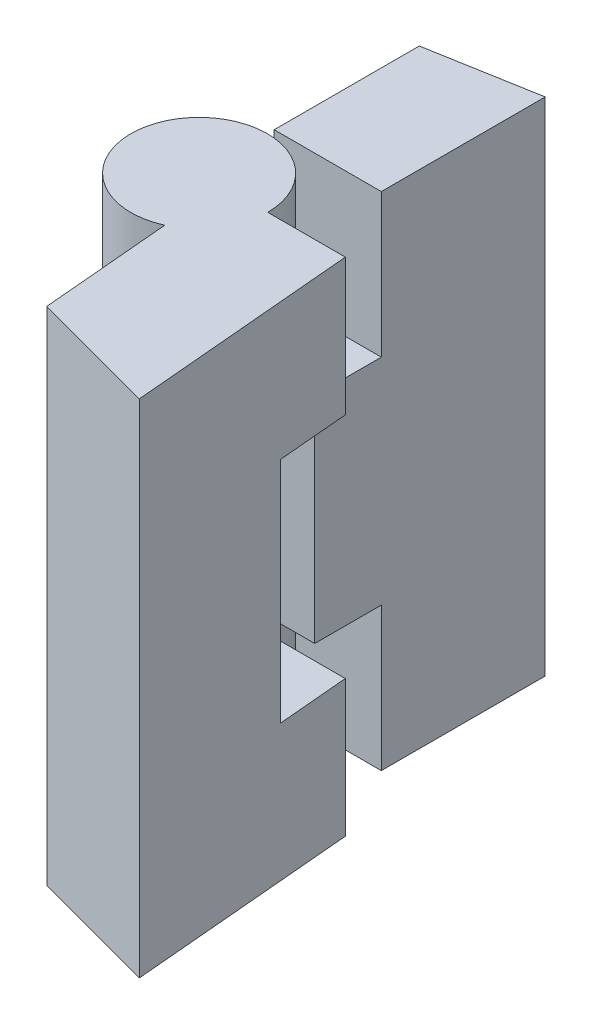
ISO-10303-21;
HEADER;
FILE_DESCRIPTION(('STEP AP214'),'2;1');
FILE_NAME('part.step','',(''),(''),'','','');
FILE_SCHEMA(('AUTOMOTIVE_DESIGN { 1 0 10303 214 1 1 1 1 }'));
ENDSEC;
DATA;
#1=APPLICATION_CONTEXT('core data for automotive mechanical design processes');
#2=APPLICATION_PROTOCOL_DEFINITION('international standard','automotive_design',2000,#1);
#3=PRODUCT_CONTEXT('',#1,'mechanical');
#4=PRODUCT('Part','Part','',(#3));
#5=PRODUCT_RELATED_PRODUCT_CATEGORY('part','',(#4));
#6=PRODUCT_DEFINITION_FORMATION('','',#4);
#7=PRODUCT_DEFINITION_CONTEXT('part definition',#1,'design');
#8=PRODUCT_DEFINITION('design','',#6,#7);
#9=PRODUCT_DEFINITION_SHAPE('','',#8);
#10=(LENGTH_UNIT() NAMED_UNIT(*) SI_UNIT(.MILLI.,.METRE.));
#11=(NAMED_UNIT(*) PLANE_ANGLE_UNIT() SI_UNIT($,.RADIAN.));
#12=(NAMED_UNIT(*) SI_UNIT($,.STERADIAN.) SOLID_ANGLE_UNIT());
#13=UNCERTAINTY_MEASURE_WITH_UNIT(LENGTH_MEASURE(1.E-05),#10,'distance_accuracy_value','');
#14=(GEOMETRIC_REPRESENTATION_CONTEXT(3) GLOBAL_UNCERTAINTY_ASSIGNED_CONTEXT((#13)) GLOBAL_UNIT_ASSIGNED_CONTEXT((#10,
#11,#12)) REPRESENTATION_CONTEXT('',''));
#15=CARTESIAN_POINT('',(0.,0.,0.));
#16=DIRECTION('',(0.,0.,1.));
#17=DIRECTION('',(1.,0.,0.));
#18=AXIS2_PLACEMENT_3D('',#15,#16,#17);
#19=CARTESIAN_POINT('',(-149.098,172.2882,110.56875));
#20=DIRECTION('',(0.173648177666924,0.,0.984807753012209));
#21=DIRECTION('',(0.984807753012209,0.,-0.173648177666924));
#22=AXIS2_PLACEMENT_3D('',#19,#20,#21);
#23=PLANE('',#22);
#24=DIRECTION('',(0.,1.,0.));
#25=VECTOR('',#24,1.);
#26=CARTESIAN_POINT('',(-159.0548,172.2882,112.324402481518));
#27=LINE('',#26,#25);
#28=CARTESIAN_POINT('',(-159.0548,125.6538,112.324402481518));
#29=VERTEX_POINT('',#28);
#30=CARTESIAN_POINT('',(-159.0548,172.2882,112.324402481518));
#31=VERTEX_POINT('',#30);
#32=EDGE_CURVE('E219',#29,#31,#27,.T.);
#33=ORIENTED_EDGE('',*,*,#32,.T.);
#34=DIRECTION('',(-0.984807753012209,0.,0.173648177666928));
#35=VECTOR('',#34,1.);
#36=CARTESIAN_POINT('',(-149.098,172.2882,110.56875));
#37=LINE('',#36,#35);
#38=CARTESIAN_POINT('',(-149.098,172.2882,110.56875));
#39=VERTEX_POINT('',#38);
#40=EDGE_CURVE('E163',#39,#31,#37,.T.);
#41=ORIENTED_EDGE('',*,*,#40,.F.);
#42=DIRECTION('',(0.,1.,0.));
#43=VECTOR('',#42,1.);
#44=CARTESIAN_POINT('',(-149.098,172.2882,110.56875));
#45=LINE('',#44,#43);
#46=CARTESIAN_POINT('',(-149.098,125.6538,110.56875));
#47=VERTEX_POINT('',#46);
#48=EDGE_CURVE('E198',#39,#47,#45,.F.);
#49=ORIENTED_EDGE('',*,*,#48,.T.);
#50=DIRECTION('',(-0.984807753012209,0.,0.173648177666928));
#51=VECTOR('',#50,1.);
#52=CARTESIAN_POINT('',(-149.098,125.6538,110.56875));
#53=LINE('',#52,#51);
#54=EDGE_CURVE('E230',#47,#29,#53,.T.);
#55=ORIENTED_EDGE('',*,*,#54,.T.);
#56=EDGE_LOOP('',(#33,#41,#49,#55));
#57=FACE_BOUND('',#56,.T.);
#58=ADVANCED_FACE('F17',(#57),#23,.F.);
#59=CARTESIAN_POINT('',(-159.0548,125.6538,132.79375));
#60=DIRECTION('',(0.,1.,0.));
#61=DIRECTION('',(0.,0.,1.));
#62=AXIS2_PLACEMENT_3D('',#59,#60,#61);
#63=PLANE('',#62);
#64=DIRECTION('',(-1.,0.,0.));
#65=VECTOR('',#64,1.);
#66=CARTESIAN_POINT('',(-166.0398,125.6538,125.80875));
#67=LINE('',#66,#65);
#68=CARTESIAN_POINT('',(-149.098,125.6538,125.80875));
#69=VERTEX_POINT('',#68);
#70=CARTESIAN_POINT('',(-159.0548,125.6538,125.80875));
#71=VERTEX_POINT('',#70);
#72=EDGE_CURVE('E200',#69,#71,#67,.T.);
#73=ORIENTED_EDGE('',*,*,#72,.T.);
#74=DIRECTION('',(0.,0.,-1.));
#75=VECTOR('',#74,1.);
#76=CARTESIAN_POINT('',(-159.0548,125.6538,126.44375));
#77=LINE('',#76,#75);
#78=EDGE_CURVE('E162',#71,#29,#77,.T.);
#79=ORIENTED_EDGE('',*,*,#78,.T.);
#80=ORIENTED_EDGE('',*,*,#54,.F.);
#81=DIRECTION('',(0.,0.,1.));
#82=VECTOR('',#81,1.);
#83=CARTESIAN_POINT('',(-149.098,125.6538,132.));
#84=LINE('',#83,#82);
#85=EDGE_CURVE('E196',#47,#69,#84,.T.);
#86=ORIENTED_EDGE('',*,*,#85,.T.);
#87=EDGE_LOOP('',(#73,#79,#80,#86));
#88=FACE_BOUND('',#87,.T.);
#89=ADVANCED_FACE('F299',(#88),#63,.F.);
#90=CARTESIAN_POINT('',(-159.0548,172.2882,132.79375));
#91=DIRECTION('',(0.,1.,0.));
#92=DIRECTION('',(0.,0.,1.));
#93=AXIS2_PLACEMENT_3D('',#90,#91,#92);
#94=PLANE('',#93);
#95=ORIENTED_EDGE('',*,*,#40,.T.);
#96=DIRECTION('',(0.,0.,-1.));
#97=VECTOR('',#96,1.);
#98=CARTESIAN_POINT('',(-159.0548,172.2882,126.44375));
#99=LINE('',#98,#97);
#100=CARTESIAN_POINT('',(-159.0548,172.2882,125.80875));
#101=VERTEX_POINT('',#100);
#102=EDGE_CURVE('E216',#31,#101,#99,.F.);
#103=ORIENTED_EDGE('',*,*,#102,.T.);
#104=DIRECTION('',(-1.,0.,0.));
#105=VECTOR('',#104,1.);
#106=CARTESIAN_POINT('',(-166.0398,172.2882,125.80875));
#107=LINE('',#106,#105);
#108=CARTESIAN_POINT('',(-149.098,172.2882,125.80875));
#109=VERTEX_POINT('',#108);
#110=EDGE_CURVE('E187',#101,#109,#107,.F.);
#111=ORIENTED_EDGE('',*,*,#110,.T.);
#112=DIRECTION('',(0.,0.,1.));
#113=VECTOR('',#112,1.);
#114=CARTESIAN_POINT('',(-149.098,172.2882,132.));
#115=LINE('',#114,#113);
#116=EDGE_CURVE('E190',#109,#39,#115,.F.);
#117=ORIENTED_EDGE('',*,*,#116,.T.);
#118=EDGE_LOOP('',(#95,#103,#111,#117));
#119=FACE_BOUND('',#118,.T.);
#120=ADVANCED_FACE('F289',(#119),#94,.T.);
#121=CARTESIAN_POINT('',(-159.0548,172.2882,126.44375));
#122=DIRECTION('',(1.,0.,0.));
#123=DIRECTION('',(0.,0.,-1.));
#124=AXIS2_PLACEMENT_3D('',#121,#122,#123);
#125=PLANE('',#124);
#126=DIRECTION('',(0.,1.,0.));
#127=VECTOR('',#126,1.);
#128=CARTESIAN_POINT('',(-159.0548,158.9532,125.80875));
#129=LINE('',#128,#127);
#130=CARTESIAN_POINT('',(-159.0548,158.9532,125.80875));
#131=VERTEX_POINT('',#130);
#132=EDGE_CURVE('E189',#131,#101,#129,.T.);
#133=ORIENTED_EDGE('',*,*,#132,.T.);
#134=ORIENTED_EDGE('',*,*,#102,.F.);
#135=ORIENTED_EDGE('',*,*,#32,.F.);
#136=ORIENTED_EDGE('',*,*,#78,.F.);
#137=DIRECTION('',(0.,1.,0.));
#138=VECTOR('',#137,1.);
#139=CARTESIAN_POINT('',(-159.0548,138.9888,125.80875));
#140=LINE('',#139,#138);
#141=CARTESIAN_POINT('',(-159.0548,138.9888,125.80875));
#142=VERTEX_POINT('',#141);
#143=EDGE_CURVE('E157',#71,#142,#140,.T.);
#144=ORIENTED_EDGE('',*,*,#143,.T.);
#145=DIRECTION('',(0.,0.,-1.));
#146=VECTOR('',#145,1.);
#147=CARTESIAN_POINT('',(-159.0548,138.9888,126.44375));
#148=LINE('',#147,#146);
#149=CARTESIAN_POINT('',(-159.0548,138.9888,126.44375));
#150=VERTEX_POINT('',#149);
#151=EDGE_CURVE('E150',#150,#142,#148,.T.);
#152=ORIENTED_EDGE('',*,*,#151,.F.);
#153=DIRECTION('',(0.,-1.,0.));
#154=VECTOR('',#153,1.);
#155=CARTESIAN_POINT('',(-159.0548,172.2882,126.44375));
#156=LINE('',#155,#154);
#157=CARTESIAN_POINT('',(-159.0548,158.9532,126.44375));
#158=VERTEX_POINT('',#157);
#159=EDGE_CURVE('E154',#158,#150,#156,.T.);
#160=ORIENTED_EDGE('',*,*,#159,.F.);
#161=DIRECTION('',(0.,0.,-1.));
#162=VECTOR('',#161,1.);
#163=CARTESIAN_POINT('',(-159.0548,158.9532,126.44375));
#164=LINE('',#163,#162);
#165=EDGE_CURVE('E218',#131,#158,#164,.F.);
#166=ORIENTED_EDGE('',*,*,#165,.F.);
#167=EDGE_LOOP('',(#133,#134,#135,#136,#144,#152,#160,#166));
#168=FACE_BOUND('',#167,.T.);
#169=ADVANCED_FACE('F153',(#168),#125,.F.);
#170=CARTESIAN_POINT('',(-166.0398,138.9888,125.80875));
#171=DIRECTION('',(0.,0.,-1.));
#172=DIRECTION('',(-1.,0.,0.));
#173=AXIS2_PLACEMENT_3D('',#170,#171,#172);
#174=PLANE('',#173);
#175=DIRECTION('',(0.,1.,0.));
#176=VECTOR('',#175,1.);
#177=CARTESIAN_POINT('',(-149.098,172.2882,125.80875));
#178=LINE('',#177,#176);
#179=CARTESIAN_POINT('',(-149.098,138.9888,125.80875));
#180=VERTEX_POINT('',#179);
#181=EDGE_CURVE('E194',#69,#180,#178,.T.);
#182=ORIENTED_EDGE('',*,*,#181,.T.);
#183=DIRECTION('',(1.,0.,0.));
#184=VECTOR('',#183,1.);
#185=CARTESIAN_POINT('',(-166.0398,138.9888,125.80875));
#186=LINE('',#185,#184);
#187=EDGE_CURVE('E175',#142,#180,#186,.T.);
#188=ORIENTED_EDGE('',*,*,#187,.F.);
#189=ORIENTED_EDGE('',*,*,#143,.F.);
#190=ORIENTED_EDGE('',*,*,#72,.F.);
#191=EDGE_LOOP('',(#182,#188,#189,#190));
#192=FACE_BOUND('',#191,.T.);
#193=ADVANCED_FACE('F303',(#192),#174,.F.);
#194=CARTESIAN_POINT('',(-152.754604690527,172.2882,132.));
#195=DIRECTION('',(0.,0.,-1.));
#196=DIRECTION('',(-1.,0.,0.));
#197=AXIS2_PLACEMENT_3D('',#194,#195,#196);
#198=PLANE('',#197);
#199=DIRECTION('',(0.,-1.,0.));
#200=VECTOR('',#199,1.);
#201=CARTESIAN_POINT('',(-152.754604690527,172.2882,132.));
#202=LINE('',#201,#200);
#203=CARTESIAN_POINT('',(-152.754604690527,138.9888,132.));
#204=VERTEX_POINT('',#203);
#205=CARTESIAN_POINT('',(-152.754604690527,158.9532,132.));
#206=VERTEX_POINT('',#205);
#207=EDGE_CURVE('E144',#204,#206,#202,.F.);
#208=ORIENTED_EDGE('',*,*,#207,.F.);
#209=DIRECTION('',(1.,0.,0.));
#210=VECTOR('',#209,1.);
#211=CARTESIAN_POINT('',(-166.0398,138.9888,132.));
#212=LINE('',#211,#210);
#213=CARTESIAN_POINT('',(-149.098,138.9888,132.));
#214=VERTEX_POINT('',#213);
#215=EDGE_CURVE('E174',#214,#204,#212,.F.);
#216=ORIENTED_EDGE('',*,*,#215,.F.);
#217=DIRECTION('',(0.,1.,0.));
#218=VECTOR('',#217,1.);
#219=CARTESIAN_POINT('',(-149.098,172.2882,132.));
#220=LINE('',#219,#218);
#221=CARTESIAN_POINT('',(-149.098,158.9532,132.));
#222=VERTEX_POINT('',#221);
#223=EDGE_CURVE('E193',#214,#222,#220,.T.);
#224=ORIENTED_EDGE('',*,*,#223,.T.);
#225=DIRECTION('',(1.,0.,0.));
#226=VECTOR('',#225,1.);
#227=CARTESIAN_POINT('',(-166.0398,158.9532,132.));
#228=LINE('',#227,#226);
#229=EDGE_CURVE('E205',#206,#222,#228,.T.);
#230=ORIENTED_EDGE('',*,*,#229,.F.);
#231=EDGE_LOOP('',(#208,#216,#224,#230));
#232=FACE_BOUND('',#231,.T.);
#233=ADVANCED_FACE('F306',(#232),#198,.F.);
#234=CARTESIAN_POINT('',(-149.098,172.2882,132.));
#235=DIRECTION('',(-1.,0.,0.));
#236=DIRECTION('',(0.,0.,1.));
#237=AXIS2_PLACEMENT_3D('',#234,#235,#236);
#238=PLANE('',#237);
#239=DIRECTION('',(0.,1.,0.));
#240=VECTOR('',#239,1.);
#241=CARTESIAN_POINT('',(-149.098,158.9532,125.80875));
#242=LINE('',#241,#240);
#243=CARTESIAN_POINT('',(-149.098,158.9532,125.80875));
#244=VERTEX_POINT('',#243);
#245=EDGE_CURVE('E170',#109,#244,#242,.F.);
#246=ORIENTED_EDGE('',*,*,#245,.T.);
#247=DIRECTION('',(0.,0.,1.));
#248=VECTOR('',#247,1.);
#249=CARTESIAN_POINT('',(-149.098,158.9532,139.77875));
#250=LINE('',#249,#248);
#251=EDGE_CURVE('E201',#222,#244,#250,.F.);
#252=ORIENTED_EDGE('',*,*,#251,.F.);
#253=ORIENTED_EDGE('',*,*,#223,.F.);
#254=DIRECTION('',(0.,0.,-1.));
#255=VECTOR('',#254,1.);
#256=CARTESIAN_POINT('',(-149.098,138.9888,125.80875));
#257=LINE('',#256,#255);
#258=EDGE_CURVE('E176',#180,#214,#257,.F.);
#259=ORIENTED_EDGE('',*,*,#258,.F.);
#260=ORIENTED_EDGE('',*,*,#181,.F.);
#261=ORIENTED_EDGE('',*,*,#85,.F.);
#262=ORIENTED_EDGE('',*,*,#48,.F.);
#263=ORIENTED_EDGE('',*,*,#116,.F.);
#264=EDGE_LOOP('',(#246,#252,#253,#259,#260,#261,#262,#263));
#265=FACE_BOUND('',#264,.T.);
#266=ADVANCED_FACE('F292',(#265),#238,.F.);
#267=CARTESIAN_POINT('',(-166.0398,158.9532,125.80875));
#268=DIRECTION('',(0.,0.,-1.));
#269=DIRECTION('',(-1.,0.,0.));
#270=AXIS2_PLACEMENT_3D('',#267,#268,#269);
#271=PLANE('',#270);
#272=ORIENTED_EDGE('',*,*,#245,.F.);
#273=ORIENTED_EDGE('',*,*,#110,.F.);
#274=ORIENTED_EDGE('',*,*,#132,.F.);
#275=DIRECTION('',(1.,0.,0.));
#276=VECTOR('',#275,1.);
#277=CARTESIAN_POINT('',(-166.0398,158.9532,125.80875));
#278=LINE('',#277,#276);
#279=EDGE_CURVE('E204',#244,#131,#278,.F.);
#280=ORIENTED_EDGE('',*,*,#279,.F.);
#281=EDGE_LOOP('',(#272,#273,#274,#280));
#282=FACE_BOUND('',#281,.T.);
#283=ADVANCED_FACE('F286',(#282),#271,.F.);
#284=CARTESIAN_POINT('',(-159.0548,172.2882,132.79375));
#285=DIRECTION('',(0.,-1.,0.));
#286=DIRECTION('',(0.,0.,-1.));
#287=AXIS2_PLACEMENT_3D('',#284,#285,#286);
#288=CYLINDRICAL_SURFACE('',#287,6.34999999999999);
#289=CARTESIAN_POINT('',(-159.0548,138.9888,132.79375));
#290=DIRECTION('',(0.,-1.,0.));
#291=DIRECTION('',(0.,0.,-1.));
#292=AXIS2_PLACEMENT_3D('',#289,#290,#291);
#293=CIRCLE('',#292,6.34999999999999);
#294=EDGE_CURVE('E20',#204,#150,#293,.T.);
#295=ORIENTED_EDGE('',*,*,#294,.F.);
#296=ORIENTED_EDGE('',*,*,#207,.T.);
#297=CARTESIAN_POINT('',(-159.0548,158.9532,132.79375));
#298=DIRECTION('',(0.,-1.,0.));
#299=DIRECTION('',(0.,0.,-1.));
#300=AXIS2_PLACEMENT_3D('',#297,#298,#299);
#301=CIRCLE('',#300,6.34999999999999);
#302=EDGE_CURVE('E169',#158,#206,#301,.F.);
#303=ORIENTED_EDGE('',*,*,#302,.F.);
#304=ORIENTED_EDGE('',*,*,#159,.T.);
#305=EDGE_LOOP('',(#295,#296,#303,#304));
#306=FACE_BOUND('',#305,.T.);
#307=ADVANCED_FACE('F166',(#306),#288,.T.);
#308=CARTESIAN_POINT('',(-166.0398,138.9888,125.80875));
#309=DIRECTION('',(0.,-1.,0.));
#310=DIRECTION('',(0.,0.,-1.));
#311=AXIS2_PLACEMENT_3D('',#308,#309,#310);
#312=PLANE('',#311);
#313=CARTESIAN_POINT('',(-159.0548,138.9888,132.79375));
#314=DIRECTION('',(0.,-1.,0.));
#315=DIRECTION('',(0.,0.,-1.));
#316=AXIS2_PLACEMENT_3D('',#313,#314,#315);
#317=CIRCLE('',#316,3.17881);
#318=CARTESIAN_POINT('',(-159.0548,138.9888,129.61494));
#319=VERTEX_POINT('',#318);
#320=EDGE_CURVE('E275',#319,#319,#317,.T.);
#321=ORIENTED_EDGE('',*,*,#320,.F.);
#322=EDGE_LOOP('',(#321));
#323=FACE_BOUND('',#322,.T.);
#324=ORIENTED_EDGE('',*,*,#187,.T.);
#325=ORIENTED_EDGE('',*,*,#258,.T.);
#326=ORIENTED_EDGE('',*,*,#215,.T.);
#327=ORIENTED_EDGE('',*,*,#294,.T.);
#328=ORIENTED_EDGE('',*,*,#151,.T.);
#329=EDGE_LOOP('',(#324,#325,#326,#327,#328));
#330=FACE_BOUND('',#329,.T.);
#331=ADVANCED_FACE('F172',(#323,#330),#312,.T.);
#332=CARTESIAN_POINT('',(-166.0398,158.9532,139.77875));
#333=DIRECTION('',(0.,1.,0.));
#334=DIRECTION('',(0.,0.,1.));
#335=AXIS2_PLACEMENT_3D('',#332,#333,#334);
#336=PLANE('',#335);
#337=CARTESIAN_POINT('',(-159.0548,158.9532,132.79375));
#338=DIRECTION('',(0.,-1.,0.));
#339=DIRECTION('',(0.,0.,-1.));
#340=AXIS2_PLACEMENT_3D('',#337,#338,#339);
#341=CIRCLE('',#340,3.17881);
#342=CARTESIAN_POINT('',(-159.0548,158.9532,129.61494));
#343=VERTEX_POINT('',#342);
#344=EDGE_CURVE('E271',#343,#343,#341,.F.);
#345=ORIENTED_EDGE('',*,*,#344,.F.);
#346=EDGE_LOOP('',(#345));
#347=FACE_BOUND('',#346,.T.);
#348=ORIENTED_EDGE('',*,*,#165,.T.);
#349=ORIENTED_EDGE('',*,*,#302,.T.);
#350=ORIENTED_EDGE('',*,*,#229,.T.);
#351=ORIENTED_EDGE('',*,*,#251,.T.);
#352=ORIENTED_EDGE('',*,*,#279,.T.);
#353=EDGE_LOOP('',(#348,#349,#350,#351,#352));
#354=FACE_BOUND('',#353,.T.);
#355=ADVANCED_FACE('F279',(#347,#354),#336,.T.);
#356=CARTESIAN_POINT('',(-159.0548,138.3538,132.79375));
#357=DIRECTION('',(0.,-1.,0.));
#358=DIRECTION('',(0.,0.,-1.));
#359=AXIS2_PLACEMENT_3D('',#356,#357,#358);
#360=CYLINDRICAL_SURFACE('',#359,6.34999999999999);
#361=CARTESIAN_POINT('',(-159.0548,125.6538,132.79375));
#362=DIRECTION('',(0.,-1.,0.));
#363=DIRECTION('',(0.,0.,-1.));
#364=AXIS2_PLACEMENT_3D('',#361,#362,#363);
#365=CIRCLE('',#364,6.34999999999999);
#366=CARTESIAN_POINT('',(-156.455128539656,125.6538,138.587212548276));
#367=VERTEX_POINT('',#366);
#368=CARTESIAN_POINT('',(-152.704879375496,125.6538,132.762));
#369=VERTEX_POINT('',#368);
#370=EDGE_CURVE('E267',#367,#369,#365,.T.);
#371=ORIENTED_EDGE('',*,*,#370,.F.);
#372=DIRECTION('',(0.,1.,0.));
#373=VECTOR('',#372,1.);
#374=CARTESIAN_POINT('',(-156.455128539656,138.3538,138.587212548276));
#375=LINE('',#374,#373);
#376=CARTESIAN_POINT('',(-156.455128539656,138.3538,138.587212548276));
#377=VERTEX_POINT('',#376);
#378=EDGE_CURVE('E336',#377,#367,#375,.F.);
#379=ORIENTED_EDGE('',*,*,#378,.F.);
#380=CARTESIAN_POINT('',(-159.0548,138.3538,132.79375));
#381=DIRECTION('',(0.,-1.,0.));
#382=DIRECTION('',(0.,0.,-1.));
#383=AXIS2_PLACEMENT_3D('',#380,#381,#382);
#384=CIRCLE('',#383,6.34999999999999);
#385=CARTESIAN_POINT('',(-152.704879375496,138.3538,132.762));
#386=VERTEX_POINT('',#385);
#387=EDGE_CURVE('E263',#377,#386,#384,.T.);
#388=ORIENTED_EDGE('',*,*,#387,.T.);
#389=DIRECTION('',(0.,1.,0.));
#390=VECTOR('',#389,1.);
#391=CARTESIAN_POINT('',(-152.704879375496,138.3538,132.762));
#392=LINE('',#391,#390);
#393=EDGE_CURVE('E266',#369,#386,#392,.T.);
#394=ORIENTED_EDGE('',*,*,#393,.F.);
#395=EDGE_LOOP('',(#371,#379,#388,#394));
#396=FACE_BOUND('',#395,.T.);
#397=ADVANCED_FACE('F439',(#396),#360,.T.);
#398=CARTESIAN_POINT('',(-159.0548,181.279232428414,132.79375));
#399=DIRECTION('',(0.,-1.,0.));
#400=DIRECTION('',(0.,0.,-1.));
#401=AXIS2_PLACEMENT_3D('',#398,#399,#400);
#402=CYLINDRICAL_SURFACE('',#401,3.17881);
#403=ORIENTED_EDGE('',*,*,#320,.T.);
#404=EDGE_LOOP('',(#403));
#405=FACE_BOUND('',#404,.T.);
#406=CARTESIAN_POINT('',(-159.0548,138.3538,132.79375));
#407=DIRECTION('',(0.,-1.,0.));
#408=DIRECTION('',(0.,0.,-1.));
#409=AXIS2_PLACEMENT_3D('',#406,#407,#408);
#410=CIRCLE('',#409,3.17881);
#411=CARTESIAN_POINT('',(-159.0548,138.3538,129.61494));
#412=VERTEX_POINT('',#411);
#413=EDGE_CURVE('E258',#412,#412,#410,.F.);
#414=ORIENTED_EDGE('',*,*,#413,.T.);
#415=EDGE_LOOP('',(#414));
#416=FACE_BOUND('',#415,.T.);
#417=ADVANCED_FACE('F441',(#405,#416),#402,.T.);
#418=CARTESIAN_POINT('',(-159.0548,181.279232428414,132.79375));
#419=DIRECTION('',(0.,-1.,0.));
#420=DIRECTION('',(0.,0.,-1.));
#421=AXIS2_PLACEMENT_3D('',#418,#419,#420);
#422=CYLINDRICAL_SURFACE('',#421,3.17881);
#423=ORIENTED_EDGE('',*,*,#344,.T.);
#424=EDGE_LOOP('',(#423));
#425=FACE_BOUND('',#424,.T.);
#426=CARTESIAN_POINT('',(-159.0548,159.5882,132.79375));
#427=DIRECTION('',(0.,-1.,0.));
#428=DIRECTION('',(0.,0.,-1.));
#429=AXIS2_PLACEMENT_3D('',#426,#427,#428);
#430=CIRCLE('',#429,3.17881);
#431=CARTESIAN_POINT('',(-159.0548,159.5882,129.61494));
#432=VERTEX_POINT('',#431);
#433=EDGE_CURVE('E249',#432,#432,#430,.T.);
#434=ORIENTED_EDGE('',*,*,#433,.T.);
#435=EDGE_LOOP('',(#434));
#436=FACE_BOUND('',#435,.T.);
#437=ADVANCED_FACE('F448',(#425,#436),#422,.T.);
#438=CARTESIAN_POINT('',(-159.0548,159.5882,132.79375));
#439=DIRECTION('',(0.,1.,0.));
#440=DIRECTION('',(0.,0.,1.));
#441=AXIS2_PLACEMENT_3D('',#438,#439,#440);
#442=CYLINDRICAL_SURFACE('',#441,6.34999999999999);
#443=CARTESIAN_POINT('',(-159.0548,172.2882,132.79375));
#444=DIRECTION('',(0.,1.,0.));
#445=DIRECTION('',(0.,0.,1.));
#446=AXIS2_PLACEMENT_3D('',#443,#444,#445);
#447=CIRCLE('',#446,6.34999999999999);
#448=CARTESIAN_POINT('',(-152.704879375496,172.2882,132.762));
#449=VERTEX_POINT('',#448);
#450=CARTESIAN_POINT('',(-156.455128539656,172.2882,138.587212548276));
#451=VERTEX_POINT('',#450);
#452=EDGE_CURVE('E244',#449,#451,#447,.T.);
#453=ORIENTED_EDGE('',*,*,#452,.F.);
#454=DIRECTION('',(0.,1.,0.));
#455=VECTOR('',#454,1.);
#456=CARTESIAN_POINT('',(-152.704879375496,159.5882,132.762));
#457=LINE('',#456,#455);
#458=CARTESIAN_POINT('',(-152.704879375496,159.5882,132.762));
#459=VERTEX_POINT('',#458);
#460=EDGE_CURVE('E357',#459,#449,#457,.T.);
#461=ORIENTED_EDGE('',*,*,#460,.F.);
#462=CARTESIAN_POINT('',(-159.0548,159.5882,132.79375));
#463=DIRECTION('',(0.,1.,0.));
#464=DIRECTION('',(0.,0.,1.));
#465=AXIS2_PLACEMENT_3D('',#462,#463,#464);
#466=CIRCLE('',#465,6.34999999999999);
#467=CARTESIAN_POINT('',(-156.455128539656,159.5882,138.587212548276));
#468=VERTEX_POINT('',#467);
#469=EDGE_CURVE('E254',#459,#468,#466,.T.);
#470=ORIENTED_EDGE('',*,*,#469,.T.);
#471=DIRECTION('',(0.,1.,0.));
#472=VECTOR('',#471,1.);
#473=CARTESIAN_POINT('',(-156.455128539656,138.3538,138.587212548276));
#474=LINE('',#473,#472);
#475=EDGE_CURVE('E274',#451,#468,#474,.F.);
#476=ORIENTED_EDGE('',*,*,#475,.F.);
#477=EDGE_LOOP('',(#453,#461,#470,#476));
#478=FACE_BOUND('',#477,.T.);
#479=ADVANCED_FACE('F420',(#478),#442,.T.);
#480=CARTESIAN_POINT('',(-155.403435247977,138.3538,150.608121878636));
#481=DIRECTION('',(-0.996194698091746,0.,0.0871557427476569));
#482=DIRECTION('',(0.0871557427476569,0.,0.996194698091746));
#483=AXIS2_PLACEMENT_3D('',#480,#481,#482);
#484=PLANE('',#483);
#485=DIRECTION('',(-0.0871557427479594,0.,-0.996194698091719));
#486=VECTOR('',#485,1.);
#487=CARTESIAN_POINT('',(-156.388462178049,138.3538,139.349212548276));
#488=LINE('',#487,#486);
#489=CARTESIAN_POINT('',(-156.388462178049,138.353800000003,139.349212548276));
#490=VERTEX_POINT('',#489);
#491=EDGE_CURVE('E262',#490,#377,#488,.T.);
#492=ORIENTED_EDGE('',*,*,#491,.T.);
#493=ORIENTED_EDGE('',*,*,#378,.T.);
#494=DIRECTION('',(-0.0871557427476147,0.,-0.996194698091749));
#495=VECTOR('',#494,1.);
#496=CARTESIAN_POINT('',(-155.403435247977,125.6538,150.608121878636));
#497=LINE('',#496,#495);
#498=CARTESIAN_POINT('',(-155.403435247977,125.6538,150.608121878636));
#499=VERTEX_POINT('',#498);
#500=EDGE_CURVE('E270',#499,#367,#497,.T.);
#501=ORIENTED_EDGE('',*,*,#500,.F.);
#502=DIRECTION('',(0.,1.,0.));
#503=VECTOR('',#502,1.);
#504=CARTESIAN_POINT('',(-155.403435247977,138.3538,150.608121878637));
#505=LINE('',#504,#503);
#506=CARTESIAN_POINT('',(-155.403435247977,172.2882,150.608121878636));
#507=VERTEX_POINT('',#506);
#508=EDGE_CURVE('E319',#507,#499,#505,.F.);
#509=ORIENTED_EDGE('',*,*,#508,.F.);
#510=DIRECTION('',(0.0871557427476147,0.,0.996194698091749));
#511=VECTOR('',#510,1.);
#512=CARTESIAN_POINT('',(-156.455128539656,172.2882,138.587212548276));
#513=LINE('',#512,#511);
#514=EDGE_CURVE('E247',#451,#507,#513,.T.);
#515=ORIENTED_EDGE('',*,*,#514,.F.);
#516=ORIENTED_EDGE('',*,*,#475,.T.);
#517=DIRECTION('',(0.0871557427479594,0.,0.996194698091719));
#518=VECTOR('',#517,1.);
#519=CARTESIAN_POINT('',(-156.455128539656,159.5882,138.587212548276));
#520=LINE('',#519,#518);
#521=CARTESIAN_POINT('',(-156.388462178049,159.588199999991,139.349212548276));
#522=VERTEX_POINT('',#521);
#523=EDGE_CURVE('E256',#468,#522,#520,.T.);
#524=ORIENTED_EDGE('',*,*,#523,.T.);
#525=DIRECTION('',(0.,1.,0.));
#526=VECTOR('',#525,1.);
#527=CARTESIAN_POINT('',(-156.388462178049,-499851.029,139.349212548276));
#528=LINE('',#527,#526);
#529=EDGE_CURVE('E261',#522,#490,#528,.F.);
#530=ORIENTED_EDGE('',*,*,#529,.T.);
#531=EDGE_LOOP('',(#492,#493,#501,#509,#515,#516,#524,#530));
#532=FACE_BOUND('',#531,.T.);
#533=ADVANCED_FACE('F422',(#532),#484,.T.);
#534=CARTESIAN_POINT('',(-159.0548,125.6538,132.79375));
#535=DIRECTION('',(0.,-1.,0.));
#536=DIRECTION('',(0.,0.,-1.));
#537=AXIS2_PLACEMENT_3D('',#534,#535,#536);
#538=PLANE('',#537);
#539=DIRECTION('',(-1.,0.,0.));
#540=VECTOR('',#539,1.);
#541=CARTESIAN_POINT('',(-152.704879375496,125.6538,132.762));
#542=LINE('',#541,#540);
#543=CARTESIAN_POINT('',(-145.491107857139,125.6538,132.762));
#544=VERTEX_POINT('',#543);
#545=EDGE_CURVE('E269',#544,#369,#542,.T.);
#546=ORIENTED_EDGE('',*,*,#545,.F.);
#547=DIRECTION('',(-0.0871557427476575,0.,-0.996194698091746));
#548=VECTOR('',#547,1.);
#549=CARTESIAN_POINT('',(-143.654346290302,125.6538,153.756280776647));
#550=LINE('',#549,#548);
#551=CARTESIAN_POINT('',(-143.654346290302,125.6538,153.756280776647));
#552=VERTEX_POINT('',#551);
#553=EDGE_CURVE('E315',#552,#544,#550,.T.);
#554=ORIENTED_EDGE('',*,*,#553,.F.);
#555=DIRECTION('',(0.965925826289069,0.,0.258819045102519));
#556=VECTOR('',#555,1.);
#557=CARTESIAN_POINT('',(-143.654346290302,125.6538,153.756280776647));
#558=LINE('',#557,#556);
#559=EDGE_CURVE('E310',#499,#552,#558,.T.);
#560=ORIENTED_EDGE('',*,*,#559,.F.);
#561=ORIENTED_EDGE('',*,*,#500,.T.);
#562=ORIENTED_EDGE('',*,*,#370,.T.);
#563=EDGE_LOOP('',(#546,#554,#560,#561,#562));
#564=FACE_BOUND('',#563,.T.);
#565=ADVANCED_FACE('F427',(#564),#538,.T.);
#566=CARTESIAN_POINT('',(-152.704879375496,138.3538,132.762));
#567=DIRECTION('',(0.,0.,-1.));
#568=DIRECTION('',(-1.,0.,0.));
#569=AXIS2_PLACEMENT_3D('',#566,#567,#568);
#570=PLANE('',#569);
#571=DIRECTION('',(1.,0.,0.));
#572=VECTOR('',#571,1.);
#573=CARTESIAN_POINT('',(-159.0548,138.3538,132.762));
#574=LINE('',#573,#572);
#575=CARTESIAN_POINT('',(-145.491107857139,138.3538,132.762));
#576=VERTEX_POINT('',#575);
#577=EDGE_CURVE('E265',#386,#576,#574,.T.);
#578=ORIENTED_EDGE('',*,*,#577,.T.);
#579=DIRECTION('',(0.,1.,0.));
#580=VECTOR('',#579,1.);
#581=CARTESIAN_POINT('',(-145.491107857139,138.3538,132.762));
#582=LINE('',#581,#580);
#583=EDGE_CURVE('E318',#544,#576,#582,.T.);
#584=ORIENTED_EDGE('',*,*,#583,.F.);
#585=ORIENTED_EDGE('',*,*,#545,.T.);
#586=ORIENTED_EDGE('',*,*,#393,.T.);
#587=EDGE_LOOP('',(#578,#584,#585,#586));
#588=FACE_BOUND('',#587,.T.);
#589=ADVANCED_FACE('F430',(#588),#570,.T.);
#590=CARTESIAN_POINT('',(-159.0548,138.3538,132.79375));
#591=DIRECTION('',(0.,-1.,0.));
#592=DIRECTION('',(0.,0.,-1.));
#593=AXIS2_PLACEMENT_3D('',#590,#591,#592);
#594=PLANE('',#593);
#595=ORIENTED_EDGE('',*,*,#413,.F.);
#596=EDGE_LOOP('',(#595));
#597=FACE_BOUND('',#596,.T.);
#598=DIRECTION('',(1.,0.,0.));
#599=VECTOR('',#598,1.);
#600=CARTESIAN_POINT('',(-156.388462178049,138.353800000004,139.349212548276));
#601=LINE('',#600,#599);
#602=CARTESIAN_POINT('',(-144.914801434929,138.353800000001,139.349212548276));
#603=VERTEX_POINT('',#602);
#604=EDGE_CURVE('E257',#490,#603,#601,.T.);
#605=ORIENTED_EDGE('',*,*,#604,.T.);
#606=DIRECTION('',(-0.0871557427476575,0.,-0.996194698091746));
#607=VECTOR('',#606,1.);
#608=CARTESIAN_POINT('',(-143.654346290302,138.3538,153.756280776647));
#609=LINE('',#608,#607);
#610=EDGE_CURVE('E328',#576,#603,#609,.F.);
#611=ORIENTED_EDGE('',*,*,#610,.F.);
#612=ORIENTED_EDGE('',*,*,#577,.F.);
#613=ORIENTED_EDGE('',*,*,#387,.F.);
#614=ORIENTED_EDGE('',*,*,#491,.F.);
#615=EDGE_LOOP('',(#605,#611,#612,#613,#614));
#616=FACE_BOUND('',#615,.T.);
#617=ADVANCED_FACE('F435',(#597,#616),#594,.F.);
#618=CARTESIAN_POINT('',(-156.388462178049,-499851.029,139.349212548276));
#619=DIRECTION('',(0.,0.,1.));
#620=DIRECTION('',(1.,0.,0.));
#621=AXIS2_PLACEMENT_3D('',#618,#619,#620);
#622=PLANE('',#621);
#623=ORIENTED_EDGE('',*,*,#529,.F.);
#624=DIRECTION('',(1.,0.,0.));
#625=VECTOR('',#624,1.);
#626=CARTESIAN_POINT('',(-159.0548,159.5882,139.349212548276));
#627=LINE('',#626,#625);
#628=CARTESIAN_POINT('',(-144.914801434929,159.588199999983,139.349212548276));
#629=VERTEX_POINT('',#628);
#630=EDGE_CURVE('E253',#522,#629,#627,.T.);
#631=ORIENTED_EDGE('',*,*,#630,.T.);
#632=DIRECTION('',(0.,1.,0.));
#633=VECTOR('',#632,1.);
#634=CARTESIAN_POINT('',(-144.914801434929,138.3538,139.349212548276));
#635=LINE('',#634,#633);
#636=EDGE_CURVE('E333',#603,#629,#635,.T.);
#637=ORIENTED_EDGE('',*,*,#636,.F.);
#638=ORIENTED_EDGE('',*,*,#604,.F.);
#639=EDGE_LOOP('',(#623,#631,#637,#638));
#640=FACE_BOUND('',#639,.T.);
#641=ADVANCED_FACE('F406',(#640),#622,.F.);
#642=CARTESIAN_POINT('',(-159.0548,159.5882,132.79375));
#643=DIRECTION('',(0.,1.,0.));
#644=DIRECTION('',(0.,0.,1.));
#645=AXIS2_PLACEMENT_3D('',#642,#643,#644);
#646=PLANE('',#645);
#647=ORIENTED_EDGE('',*,*,#433,.F.);
#648=EDGE_LOOP('',(#647));
#649=FACE_BOUND('',#648,.T.);
#650=ORIENTED_EDGE('',*,*,#523,.F.);
#651=ORIENTED_EDGE('',*,*,#469,.F.);
#652=DIRECTION('',(-1.,0.,0.));
#653=VECTOR('',#652,1.);
#654=CARTESIAN_POINT('',(-145.491107857139,159.5882,132.762));
#655=LINE('',#654,#653);
#656=CARTESIAN_POINT('',(-145.491107857139,159.588199999998,132.762));
#657=VERTEX_POINT('',#656);
#658=EDGE_CURVE('E252',#657,#459,#655,.T.);
#659=ORIENTED_EDGE('',*,*,#658,.F.);
#660=DIRECTION('',(-0.0871557427476575,0.,-0.996194698091746));
#661=VECTOR('',#660,1.);
#662=CARTESIAN_POINT('',(-143.654346290302,159.588199999986,153.756280776647));
#663=LINE('',#662,#661);
#664=EDGE_CURVE('E349',#629,#657,#663,.T.);
#665=ORIENTED_EDGE('',*,*,#664,.F.);
#666=ORIENTED_EDGE('',*,*,#630,.F.);
#667=EDGE_LOOP('',(#650,#651,#659,#665,#666));
#668=FACE_BOUND('',#667,.T.);
#669=ADVANCED_FACE('F410',(#649,#668),#646,.F.);
#670=CARTESIAN_POINT('',(-145.491107857139,159.5882,132.762));
#671=DIRECTION('',(0.,0.,-1.));
#672=DIRECTION('',(-1.,0.,0.));
#673=AXIS2_PLACEMENT_3D('',#670,#671,#672);
#674=PLANE('',#673);
#675=ORIENTED_EDGE('',*,*,#658,.T.);
#676=ORIENTED_EDGE('',*,*,#460,.T.);
#677=DIRECTION('',(1.,0.,0.));
#678=VECTOR('',#677,1.);
#679=CARTESIAN_POINT('',(-159.0548,172.2882,132.762));
#680=LINE('',#679,#678);
#681=CARTESIAN_POINT('',(-145.491107857139,172.2882,132.762));
#682=VERTEX_POINT('',#681);
#683=EDGE_CURVE('E248',#682,#449,#680,.F.);
#684=ORIENTED_EDGE('',*,*,#683,.F.);
#685=DIRECTION('',(0.,1.,0.));
#686=VECTOR('',#685,1.);
#687=CARTESIAN_POINT('',(-145.491107857139,138.3538,132.762));
#688=LINE('',#687,#686);
#689=EDGE_CURVE('E352',#657,#682,#688,.T.);
#690=ORIENTED_EDGE('',*,*,#689,.F.);
#691=EDGE_LOOP('',(#675,#676,#684,#690));
#692=FACE_BOUND('',#691,.T.);
#693=ADVANCED_FACE('F414',(#692),#674,.T.);
#694=CARTESIAN_POINT('',(-159.0548,172.2882,132.79375));
#695=DIRECTION('',(0.,1.,0.));
#696=DIRECTION('',(0.,0.,1.));
#697=AXIS2_PLACEMENT_3D('',#694,#695,#696);
#698=PLANE('',#697);
#699=ORIENTED_EDGE('',*,*,#452,.T.);
#700=ORIENTED_EDGE('',*,*,#514,.T.);
#701=DIRECTION('',(0.965925826289069,0.,0.258819045102519));
#702=VECTOR('',#701,1.);
#703=CARTESIAN_POINT('',(-143.654346290302,172.2882,153.756280776647));
#704=LINE('',#703,#702);
#705=CARTESIAN_POINT('',(-143.654346290302,172.2882,153.756280776647));
#706=VERTEX_POINT('',#705);
#707=EDGE_CURVE('E35',#706,#507,#704,.F.);
#708=ORIENTED_EDGE('',*,*,#707,.F.);
#709=DIRECTION('',(-0.0871557427476575,0.,-0.996194698091746));
#710=VECTOR('',#709,1.);
#711=CARTESIAN_POINT('',(-143.654346290302,172.2882,153.756280776647));
#712=LINE('',#711,#710);
#713=EDGE_CURVE('E26',#682,#706,#712,.F.);
#714=ORIENTED_EDGE('',*,*,#713,.F.);
#715=ORIENTED_EDGE('',*,*,#683,.T.);
#716=EDGE_LOOP('',(#699,#700,#708,#714,#715));
#717=FACE_BOUND('',#716,.T.);
#718=ADVANCED_FACE('F415',(#717),#698,.T.);
#719=CARTESIAN_POINT('',(-143.654346290302,138.3538,153.756280776647));
#720=DIRECTION('',(-0.258819045102519,0.,0.965925826289069));
#721=DIRECTION('',(0.965925826289069,0.,0.258819045102519));
#722=AXIS2_PLACEMENT_3D('',#719,#720,#721);
#723=PLANE('',#722);
#724=ORIENTED_EDGE('',*,*,#707,.T.);
#725=ORIENTED_EDGE('',*,*,#508,.T.);
#726=ORIENTED_EDGE('',*,*,#559,.T.);
#727=DIRECTION('',(0.,1.,0.));
#728=VECTOR('',#727,1.);
#729=CARTESIAN_POINT('',(-143.654346290302,138.3538,153.756280776647));
#730=LINE('',#729,#728);
#731=EDGE_CURVE('E11',#706,#552,#730,.F.);
#732=ORIENTED_EDGE('',*,*,#731,.F.);
#733=EDGE_LOOP('',(#724,#725,#726,#732));
#734=FACE_BOUND('',#733,.T.);
#735=ADVANCED_FACE('F425',(#734),#723,.T.);
#736=CARTESIAN_POINT('',(-143.654346290302,138.3538,153.756280776647));
#737=DIRECTION('',(0.996194698091746,0.,-0.0871557427476575));
#738=DIRECTION('',(-0.0871557427476575,0.,-0.996194698091746));
#739=AXIS2_PLACEMENT_3D('',#736,#737,#738);
#740=PLANE('',#739);
#741=ORIENTED_EDGE('',*,*,#713,.T.);
#742=ORIENTED_EDGE('',*,*,#731,.T.);
#743=ORIENTED_EDGE('',*,*,#553,.T.);
#744=ORIENTED_EDGE('',*,*,#583,.T.);
#745=ORIENTED_EDGE('',*,*,#610,.T.);
#746=ORIENTED_EDGE('',*,*,#636,.T.);
#747=ORIENTED_EDGE('',*,*,#664,.T.);
#748=ORIENTED_EDGE('',*,*,#689,.T.);
#749=EDGE_LOOP('',(#741,#742,#743,#744,#745,#746,#747,#748));
#750=FACE_BOUND('',#749,.T.);
#751=ADVANCED_FACE('F400',(#750),#740,.T.);
#752=CLOSED_SHELL('',(#58,#89,#120,#169,#193,#233,#266,#283,#307,#331,#355,#397,#417,#437,#479,
#533,#565,#589,#617,#641,#669,#693,#718,#735,#751));
#753=MANIFOLD_SOLID_BREP('B1',#752);
#754=ADVANCED_BREP_SHAPE_REPRESENTATION('',(#18,#753),#14);
#755=SHAPE_DEFINITION_REPRESENTATION(#9,#754);
ENDSEC;
END-ISO-10303-21;
